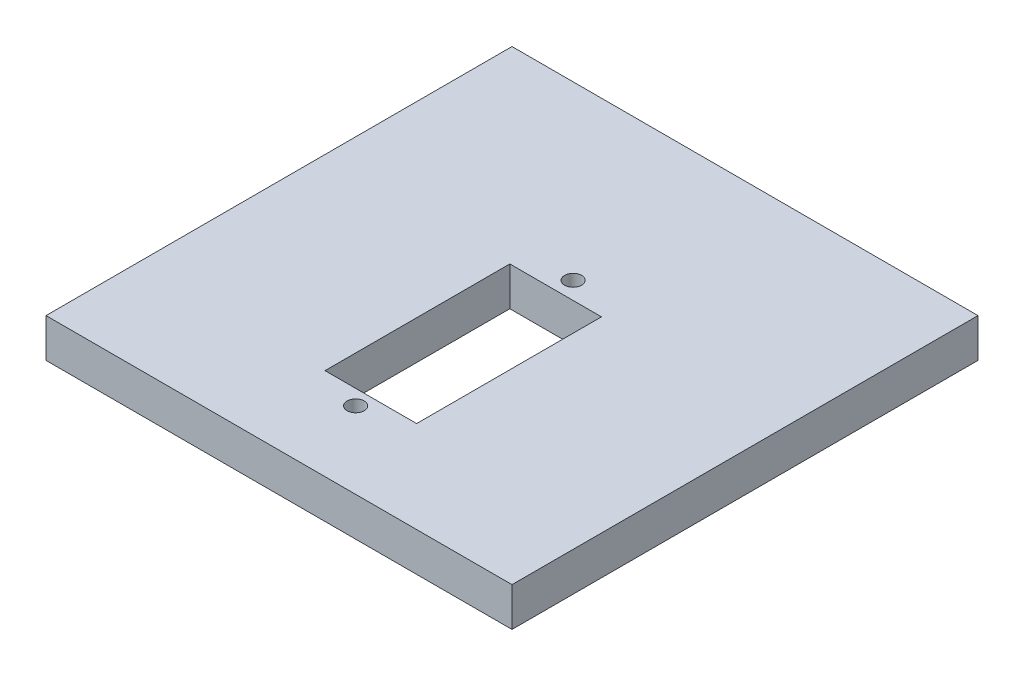
ISO-10303-21;
HEADER;
FILE_DESCRIPTION(('STEP AP214'),'2;1');
FILE_NAME('part.step','',(''),(''),'','','');
FILE_SCHEMA(('AUTOMOTIVE_DESIGN { 1 0 10303 214 1 1 1 1 }'));
ENDSEC;
DATA;
#1=APPLICATION_CONTEXT('core data for automotive mechanical design processes');
#2=APPLICATION_PROTOCOL_DEFINITION('international standard','automotive_design',2000,#1);
#3=PRODUCT_CONTEXT('',#1,'mechanical');
#4=PRODUCT('Part','Part','',(#3));
#5=PRODUCT_RELATED_PRODUCT_CATEGORY('part','',(#4));
#6=PRODUCT_DEFINITION_FORMATION('','',#4);
#7=PRODUCT_DEFINITION_CONTEXT('part definition',#1,'design');
#8=PRODUCT_DEFINITION('design','',#6,#7);
#9=PRODUCT_DEFINITION_SHAPE('','',#8);
#10=(LENGTH_UNIT() NAMED_UNIT(*) SI_UNIT(.MILLI.,.METRE.));
#11=(NAMED_UNIT(*) PLANE_ANGLE_UNIT() SI_UNIT($,.RADIAN.));
#12=(NAMED_UNIT(*) SI_UNIT($,.STERADIAN.) SOLID_ANGLE_UNIT());
#13=UNCERTAINTY_MEASURE_WITH_UNIT(LENGTH_MEASURE(1.E-05),#10,'distance_accuracy_value','');
#14=(GEOMETRIC_REPRESENTATION_CONTEXT(3) GLOBAL_UNCERTAINTY_ASSIGNED_CONTEXT((#13)) GLOBAL_UNIT_ASSIGNED_CONTEXT((#10,
#11,#12)) REPRESENTATION_CONTEXT('',''));
#15=CARTESIAN_POINT('',(0.,0.,0.));
#16=DIRECTION('',(0.,0.,1.));
#17=DIRECTION('',(1.,0.,0.));
#18=AXIS2_PLACEMENT_3D('',#15,#16,#17);
#19=CARTESIAN_POINT('',(0.,5.,60.));
#20=DIRECTION('',(0.,0.,-1.));
#21=DIRECTION('',(-1.,0.,0.));
#22=AXIS2_PLACEMENT_3D('',#19,#20,#21);
#23=PLANE('',#22);
#24=DIRECTION('',(1.,0.,0.));
#25=VECTOR('',#24,1.);
#26=CARTESIAN_POINT('',(0.,0.,60.));
#27=LINE('',#26,#25);
#28=CARTESIAN_POINT('',(0.,0.,60.));
#29=VERTEX_POINT('',#28);
#30=CARTESIAN_POINT('',(60.,0.,60.));
#31=VERTEX_POINT('',#30);
#32=EDGE_CURVE('E154',#29,#31,#27,.T.);
#33=ORIENTED_EDGE('',*,*,#32,.T.);
#34=DIRECTION('',(0.,-1.,0.));
#35=VECTOR('',#34,1.);
#36=CARTESIAN_POINT('',(60.,5.,60.));
#37=LINE('',#36,#35);
#38=CARTESIAN_POINT('',(60.,5.,60.));
#39=VERTEX_POINT('',#38);
#40=EDGE_CURVE('E11',#39,#31,#37,.T.);
#41=ORIENTED_EDGE('',*,*,#40,.F.);
#42=DIRECTION('',(1.,0.,0.));
#43=VECTOR('',#42,1.);
#44=CARTESIAN_POINT('',(0.,5.,60.));
#45=LINE('',#44,#43);
#46=CARTESIAN_POINT('',(0.,5.,60.));
#47=VERTEX_POINT('',#46);
#48=EDGE_CURVE('E127',#47,#39,#45,.T.);
#49=ORIENTED_EDGE('',*,*,#48,.F.);
#50=DIRECTION('',(0.,-1.,0.));
#51=VECTOR('',#50,1.);
#52=CARTESIAN_POINT('',(0.,5.,60.));
#53=LINE('',#52,#51);
#54=EDGE_CURVE('E162',#47,#29,#53,.T.);
#55=ORIENTED_EDGE('',*,*,#54,.T.);
#56=EDGE_LOOP('',(#33,#41,#49,#55));
#57=FACE_BOUND('',#56,.T.);
#58=ADVANCED_FACE('F41',(#57),#23,.F.);
#59=CARTESIAN_POINT('',(60.,5.,0.));
#60=DIRECTION('',(1.,0.,0.));
#61=DIRECTION('',(0.,0.,-1.));
#62=AXIS2_PLACEMENT_3D('',#59,#60,#61);
#63=PLANE('',#62);
#64=DIRECTION('',(0.,0.,1.));
#65=VECTOR('',#64,1.);
#66=CARTESIAN_POINT('',(60.,0.,0.));
#67=LINE('',#66,#65);
#68=CARTESIAN_POINT('',(60.,0.,0.));
#69=VERTEX_POINT('',#68);
#70=EDGE_CURVE('E118',#69,#31,#67,.T.);
#71=ORIENTED_EDGE('',*,*,#70,.F.);
#72=DIRECTION('',(0.,-1.,0.));
#73=VECTOR('',#72,1.);
#74=CARTESIAN_POINT('',(60.,5.,0.));
#75=LINE('',#74,#73);
#76=CARTESIAN_POINT('',(60.,5.,0.));
#77=VERTEX_POINT('',#76);
#78=EDGE_CURVE('E51',#77,#69,#75,.T.);
#79=ORIENTED_EDGE('',*,*,#78,.F.);
#80=DIRECTION('',(0.,0.,1.));
#81=VECTOR('',#80,1.);
#82=CARTESIAN_POINT('',(60.,5.,0.));
#83=LINE('',#82,#81);
#84=EDGE_CURVE('E116',#77,#39,#83,.T.);
#85=ORIENTED_EDGE('',*,*,#84,.T.);
#86=ORIENTED_EDGE('',*,*,#40,.T.);
#87=EDGE_LOOP('',(#71,#79,#85,#86));
#88=FACE_BOUND('',#87,.T.);
#89=ADVANCED_FACE('F115',(#88),#63,.T.);
#90=CARTESIAN_POINT('',(0.,5.,0.));
#91=DIRECTION('',(0.,0.,-1.));
#92=DIRECTION('',(-1.,0.,0.));
#93=AXIS2_PLACEMENT_3D('',#90,#91,#92);
#94=PLANE('',#93);
#95=DIRECTION('',(1.,0.,0.));
#96=VECTOR('',#95,1.);
#97=CARTESIAN_POINT('',(0.,0.,0.));
#98=LINE('',#97,#96);
#99=CARTESIAN_POINT('',(0.,0.,0.));
#100=VERTEX_POINT('',#99);
#101=EDGE_CURVE('E158',#100,#69,#98,.T.);
#102=ORIENTED_EDGE('',*,*,#101,.F.);
#103=DIRECTION('',(0.,-1.,0.));
#104=VECTOR('',#103,1.);
#105=CARTESIAN_POINT('',(0.,5.,0.));
#106=LINE('',#105,#104);
#107=CARTESIAN_POINT('',(0.,5.,0.));
#108=VERTEX_POINT('',#107);
#109=EDGE_CURVE('E87',#108,#100,#106,.T.);
#110=ORIENTED_EDGE('',*,*,#109,.F.);
#111=DIRECTION('',(1.,0.,0.));
#112=VECTOR('',#111,1.);
#113=CARTESIAN_POINT('',(0.,5.,0.));
#114=LINE('',#113,#112);
#115=EDGE_CURVE('E125',#108,#77,#114,.T.);
#116=ORIENTED_EDGE('',*,*,#115,.T.);
#117=ORIENTED_EDGE('',*,*,#78,.T.);
#118=EDGE_LOOP('',(#102,#110,#116,#117));
#119=FACE_BOUND('',#118,.T.);
#120=ADVANCED_FACE('F130',(#119),#94,.T.);
#121=CARTESIAN_POINT('',(0.,5.,24.38));
#122=DIRECTION('',(0.,0.,-1.));
#123=DIRECTION('',(-1.,0.,0.));
#124=AXIS2_PLACEMENT_3D('',#121,#122,#123);
#125=PLANE('',#124);
#126=DIRECTION('',(1.,0.,0.));
#127=VECTOR('',#126,1.);
#128=CARTESIAN_POINT('',(0.,0.,24.38));
#129=LINE('',#128,#127);
#130=CARTESIAN_POINT('',(24.1,0.,24.38));
#131=VERTEX_POINT('',#130);
#132=CARTESIAN_POINT('',(35.9,0.,24.38));
#133=VERTEX_POINT('',#132);
#134=EDGE_CURVE('E136',#131,#133,#129,.T.);
#135=ORIENTED_EDGE('',*,*,#134,.T.);
#136=DIRECTION('',(0.,-1.,0.));
#137=VECTOR('',#136,1.);
#138=CARTESIAN_POINT('',(35.9,5.,24.38));
#139=LINE('',#138,#137);
#140=CARTESIAN_POINT('',(35.9,5.,24.38));
#141=VERTEX_POINT('',#140);
#142=EDGE_CURVE('E45',#141,#133,#139,.T.);
#143=ORIENTED_EDGE('',*,*,#142,.F.);
#144=DIRECTION('',(1.,0.,0.));
#145=VECTOR('',#144,1.);
#146=CARTESIAN_POINT('',(0.,5.,24.38));
#147=LINE('',#146,#145);
#148=CARTESIAN_POINT('',(24.1,5.,24.38));
#149=VERTEX_POINT('',#148);
#150=EDGE_CURVE('E161',#149,#141,#147,.T.);
#151=ORIENTED_EDGE('',*,*,#150,.F.);
#152=DIRECTION('',(0.,-1.,0.));
#153=VECTOR('',#152,1.);
#154=CARTESIAN_POINT('',(24.1,5.,24.38));
#155=LINE('',#154,#153);
#156=EDGE_CURVE('E132',#149,#131,#155,.T.);
#157=ORIENTED_EDGE('',*,*,#156,.T.);
#158=EDGE_LOOP('',(#135,#143,#151,#157));
#159=FACE_BOUND('',#158,.T.);
#160=ADVANCED_FACE('F43',(#159),#125,.F.);
#161=CARTESIAN_POINT('',(35.9,5.,0.));
#162=DIRECTION('',(1.,0.,0.));
#163=DIRECTION('',(0.,0.,-1.));
#164=AXIS2_PLACEMENT_3D('',#161,#162,#163);
#165=PLANE('',#164);
#166=DIRECTION('',(0.,0.,1.));
#167=VECTOR('',#166,1.);
#168=CARTESIAN_POINT('',(35.9,0.,0.));
#169=LINE('',#168,#167);
#170=CARTESIAN_POINT('',(35.9,0.,48.18));
#171=VERTEX_POINT('',#170);
#172=EDGE_CURVE('E139',#133,#171,#169,.T.);
#173=ORIENTED_EDGE('',*,*,#172,.T.);
#174=DIRECTION('',(0.,-1.,0.));
#175=VECTOR('',#174,1.);
#176=CARTESIAN_POINT('',(35.9,5.,48.18));
#177=LINE('',#176,#175);
#178=CARTESIAN_POINT('',(35.9,5.,48.18));
#179=VERTEX_POINT('',#178);
#180=EDGE_CURVE('E167',#179,#171,#177,.T.);
#181=ORIENTED_EDGE('',*,*,#180,.F.);
#182=DIRECTION('',(0.,0.,1.));
#183=VECTOR('',#182,1.);
#184=CARTESIAN_POINT('',(35.9,5.,0.));
#185=LINE('',#184,#183);
#186=EDGE_CURVE('E99',#141,#179,#185,.T.);
#187=ORIENTED_EDGE('',*,*,#186,.F.);
#188=ORIENTED_EDGE('',*,*,#142,.T.);
#189=EDGE_LOOP('',(#173,#181,#187,#188));
#190=FACE_BOUND('',#189,.T.);
#191=ADVANCED_FACE('F172',(#190),#165,.F.);
#192=CARTESIAN_POINT('',(0.,5.,48.18));
#193=DIRECTION('',(0.,0.,-1.));
#194=DIRECTION('',(-1.,0.,0.));
#195=AXIS2_PLACEMENT_3D('',#192,#193,#194);
#196=PLANE('',#195);
#197=DIRECTION('',(1.,0.,0.));
#198=VECTOR('',#197,1.);
#199=CARTESIAN_POINT('',(0.,0.,48.18));
#200=LINE('',#199,#198);
#201=CARTESIAN_POINT('',(24.1,0.,48.18));
#202=VERTEX_POINT('',#201);
#203=EDGE_CURVE('E142',#202,#171,#200,.T.);
#204=ORIENTED_EDGE('',*,*,#203,.F.);
#205=DIRECTION('',(0.,-1.,0.));
#206=VECTOR('',#205,1.);
#207=CARTESIAN_POINT('',(24.1,5.,48.18));
#208=LINE('',#207,#206);
#209=CARTESIAN_POINT('',(24.1,5.,48.18));
#210=VERTEX_POINT('',#209);
#211=EDGE_CURVE('E166',#210,#202,#208,.T.);
#212=ORIENTED_EDGE('',*,*,#211,.F.);
#213=DIRECTION('',(1.,0.,0.));
#214=VECTOR('',#213,1.);
#215=CARTESIAN_POINT('',(0.,5.,48.18));
#216=LINE('',#215,#214);
#217=EDGE_CURVE('E336',#210,#179,#216,.T.);
#218=ORIENTED_EDGE('',*,*,#217,.T.);
#219=ORIENTED_EDGE('',*,*,#180,.T.);
#220=EDGE_LOOP('',(#204,#212,#218,#219));
#221=FACE_BOUND('',#220,.T.);
#222=ADVANCED_FACE('F186',(#221),#196,.T.);
#223=CARTESIAN_POINT('',(30.,5.,22.13));
#224=DIRECTION('',(0.,-1.,0.));
#225=DIRECTION('',(0.,0.,-1.));
#226=AXIS2_PLACEMENT_3D('',#223,#224,#225);
#227=CYLINDRICAL_SURFACE('',#226,1.1);
#228=CARTESIAN_POINT('',(30.,5.,22.13));
#229=DIRECTION('',(0.,1.,0.));
#230=DIRECTION('',(0.,0.,1.));
#231=AXIS2_PLACEMENT_3D('',#228,#229,#230);
#232=CIRCLE('',#231,1.1);
#233=CARTESIAN_POINT('',(30.,5.,23.23));
#234=VERTEX_POINT('',#233);
#235=EDGE_CURVE('E331',#234,#234,#232,.T.);
#236=ORIENTED_EDGE('',*,*,#235,.T.);
#237=EDGE_LOOP('',(#236));
#238=FACE_BOUND('',#237,.T.);
#239=CARTESIAN_POINT('',(30.,0.,22.13));
#240=DIRECTION('',(0.,1.,0.));
#241=DIRECTION('',(0.,0.,1.));
#242=AXIS2_PLACEMENT_3D('',#239,#240,#241);
#243=CIRCLE('',#242,1.1);
#244=CARTESIAN_POINT('',(30.,0.,23.23));
#245=VERTEX_POINT('',#244);
#246=EDGE_CURVE('E151',#245,#245,#243,.T.);
#247=ORIENTED_EDGE('',*,*,#246,.F.);
#248=EDGE_LOOP('',(#247));
#249=FACE_BOUND('',#248,.T.);
#250=ADVANCED_FACE('F188',(#238,#249),#227,.F.);
#251=CARTESIAN_POINT('',(30.,5.,50.13));
#252=DIRECTION('',(0.,-1.,0.));
#253=DIRECTION('',(0.,0.,-1.));
#254=AXIS2_PLACEMENT_3D('',#251,#252,#253);
#255=CYLINDRICAL_SURFACE('',#254,1.09999999999999);
#256=CARTESIAN_POINT('',(30.,5.,50.13));
#257=DIRECTION('',(0.,1.,0.));
#258=DIRECTION('',(0.,0.,1.));
#259=AXIS2_PLACEMENT_3D('',#256,#257,#258);
#260=CIRCLE('',#259,1.09999999999999);
#261=CARTESIAN_POINT('',(30.,5.,51.23));
#262=VERTEX_POINT('',#261);
#263=EDGE_CURVE('E328',#262,#262,#260,.T.);
#264=ORIENTED_EDGE('',*,*,#263,.T.);
#265=EDGE_LOOP('',(#264));
#266=FACE_BOUND('',#265,.T.);
#267=CARTESIAN_POINT('',(30.,0.,50.13));
#268=DIRECTION('',(0.,1.,0.));
#269=DIRECTION('',(0.,0.,1.));
#270=AXIS2_PLACEMENT_3D('',#267,#268,#269);
#271=CIRCLE('',#270,1.09999999999999);
#272=CARTESIAN_POINT('',(30.,0.,51.23));
#273=VERTEX_POINT('',#272);
#274=EDGE_CURVE('E148',#273,#273,#271,.T.);
#275=ORIENTED_EDGE('',*,*,#274,.F.);
#276=EDGE_LOOP('',(#275));
#277=FACE_BOUND('',#276,.T.);
#278=ADVANCED_FACE('F194',(#266,#277),#255,.F.);
#279=CARTESIAN_POINT('',(24.1,5.,0.));
#280=DIRECTION('',(1.,0.,0.));
#281=DIRECTION('',(0.,0.,-1.));
#282=AXIS2_PLACEMENT_3D('',#279,#280,#281);
#283=PLANE('',#282);
#284=DIRECTION('',(0.,0.,1.));
#285=VECTOR('',#284,1.);
#286=CARTESIAN_POINT('',(24.1,0.,0.));
#287=LINE('',#286,#285);
#288=EDGE_CURVE('E145',#131,#202,#287,.T.);
#289=ORIENTED_EDGE('',*,*,#288,.F.);
#290=ORIENTED_EDGE('',*,*,#156,.F.);
#291=DIRECTION('',(0.,0.,1.));
#292=VECTOR('',#291,1.);
#293=CARTESIAN_POINT('',(24.1,5.,0.));
#294=LINE('',#293,#292);
#295=EDGE_CURVE('E184',#149,#210,#294,.T.);
#296=ORIENTED_EDGE('',*,*,#295,.T.);
#297=ORIENTED_EDGE('',*,*,#211,.T.);
#298=EDGE_LOOP('',(#289,#290,#296,#297));
#299=FACE_BOUND('',#298,.T.);
#300=ADVANCED_FACE('F181',(#299),#283,.T.);
#301=CARTESIAN_POINT('',(0.,5.,0.));
#302=DIRECTION('',(1.,0.,0.));
#303=DIRECTION('',(0.,0.,-1.));
#304=AXIS2_PLACEMENT_3D('',#301,#302,#303);
#305=PLANE('',#304);
#306=DIRECTION('',(0.,0.,1.));
#307=VECTOR('',#306,1.);
#308=CARTESIAN_POINT('',(0.,0.,0.));
#309=LINE('',#308,#307);
#310=EDGE_CURVE('E90',#100,#29,#309,.T.);
#311=ORIENTED_EDGE('',*,*,#310,.T.);
#312=ORIENTED_EDGE('',*,*,#54,.F.);
#313=DIRECTION('',(0.,0.,1.));
#314=VECTOR('',#313,1.);
#315=CARTESIAN_POINT('',(0.,5.,0.));
#316=LINE('',#315,#314);
#317=EDGE_CURVE('E60',#108,#47,#316,.T.);
#318=ORIENTED_EDGE('',*,*,#317,.F.);
#319=ORIENTED_EDGE('',*,*,#109,.T.);
#320=EDGE_LOOP('',(#311,#312,#318,#319));
#321=FACE_BOUND('',#320,.T.);
#322=ADVANCED_FACE('F210',(#321),#305,.F.);
#323=CARTESIAN_POINT('',(0.,5.,0.));
#324=DIRECTION('',(0.,1.,0.));
#325=DIRECTION('',(0.,0.,1.));
#326=AXIS2_PLACEMENT_3D('',#323,#324,#325);
#327=PLANE('',#326);
#328=ORIENTED_EDGE('',*,*,#150,.T.);
#329=ORIENTED_EDGE('',*,*,#186,.T.);
#330=ORIENTED_EDGE('',*,*,#217,.F.);
#331=ORIENTED_EDGE('',*,*,#295,.F.);
#332=EDGE_LOOP('',(#328,#329,#330,#331));
#333=FACE_BOUND('',#332,.T.);
#334=ORIENTED_EDGE('',*,*,#263,.F.);
#335=EDGE_LOOP('',(#334));
#336=FACE_BOUND('',#335,.T.);
#337=ORIENTED_EDGE('',*,*,#235,.F.);
#338=EDGE_LOOP('',(#337));
#339=FACE_BOUND('',#338,.T.);
#340=ORIENTED_EDGE('',*,*,#48,.T.);
#341=ORIENTED_EDGE('',*,*,#84,.F.);
#342=ORIENTED_EDGE('',*,*,#115,.F.);
#343=ORIENTED_EDGE('',*,*,#317,.T.);
#344=EDGE_LOOP('',(#340,#341,#342,#343));
#345=FACE_BOUND('',#344,.T.);
#346=ADVANCED_FACE('F124',(#333,#336,#339,#345),#327,.T.);
#347=CARTESIAN_POINT('',(0.,0.,0.));
#348=DIRECTION('',(0.,1.,0.));
#349=DIRECTION('',(0.,0.,1.));
#350=AXIS2_PLACEMENT_3D('',#347,#348,#349);
#351=PLANE('',#350);
#352=ORIENTED_EDGE('',*,*,#134,.F.);
#353=ORIENTED_EDGE('',*,*,#288,.T.);
#354=ORIENTED_EDGE('',*,*,#203,.T.);
#355=ORIENTED_EDGE('',*,*,#172,.F.);
#356=EDGE_LOOP('',(#352,#353,#354,#355));
#357=FACE_BOUND('',#356,.T.);
#358=ORIENTED_EDGE('',*,*,#274,.T.);
#359=EDGE_LOOP('',(#358));
#360=FACE_BOUND('',#359,.T.);
#361=ORIENTED_EDGE('',*,*,#246,.T.);
#362=EDGE_LOOP('',(#361));
#363=FACE_BOUND('',#362,.T.);
#364=ORIENTED_EDGE('',*,*,#32,.F.);
#365=ORIENTED_EDGE('',*,*,#310,.F.);
#366=ORIENTED_EDGE('',*,*,#101,.T.);
#367=ORIENTED_EDGE('',*,*,#70,.T.);
#368=EDGE_LOOP('',(#364,#365,#366,#367));
#369=FACE_BOUND('',#368,.T.);
#370=ADVANCED_FACE('F178',(#357,#360,#363,#369),#351,.F.);
#371=CLOSED_SHELL('',(#58,#89,#120,#160,#191,#222,#250,#278,#300,#322,#346,#370));
#372=MANIFOLD_SOLID_BREP('B2',#371);
#373=ADVANCED_BREP_SHAPE_REPRESENTATION('',(#18,#372),#14);
#374=SHAPE_DEFINITION_REPRESENTATION(#9,#373);
ENDSEC;
END-ISO-10303-21;
